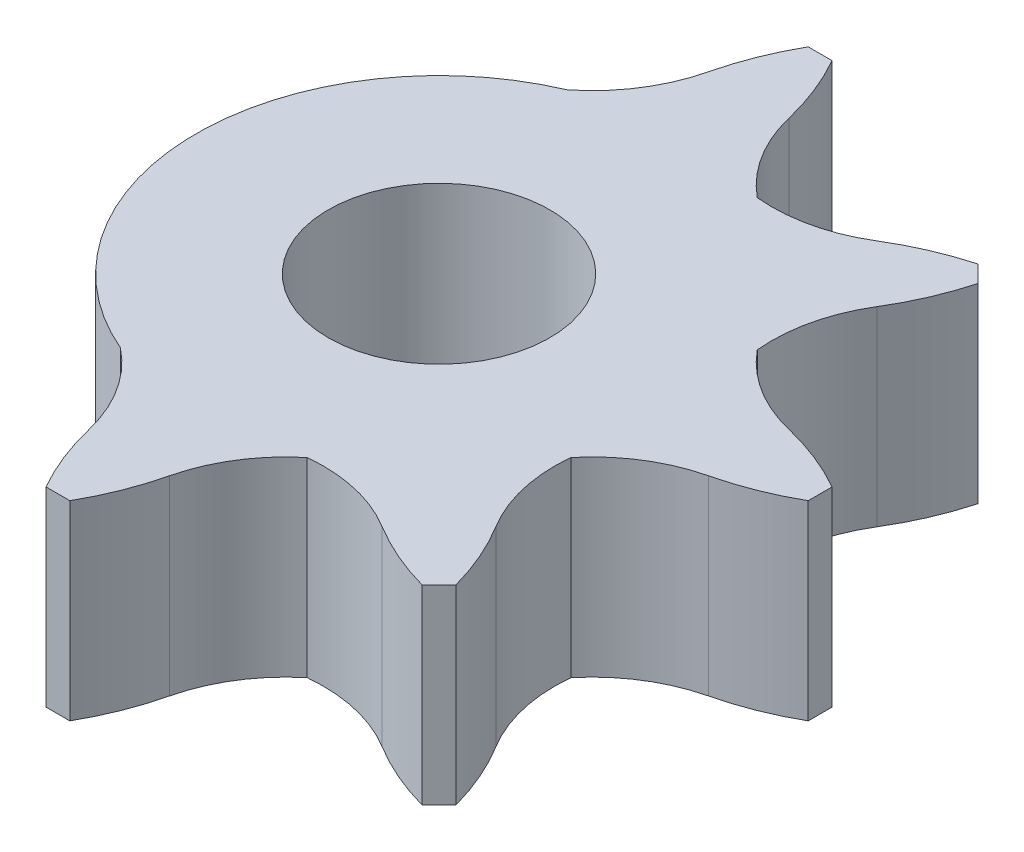
ISO-10303-21;
HEADER;
FILE_DESCRIPTION(('STEP AP214'),'2;1');
FILE_NAME('part.step','',(''),(''),'','','');
FILE_SCHEMA(('AUTOMOTIVE_DESIGN { 1 0 10303 214 1 1 1 1 }'));
ENDSEC;
DATA;
#1=APPLICATION_CONTEXT('core data for automotive mechanical design processes');
#2=APPLICATION_PROTOCOL_DEFINITION('international standard','automotive_design',2000,#1);
#3=PRODUCT_CONTEXT('',#1,'mechanical');
#4=PRODUCT('Part','Part','',(#3));
#5=PRODUCT_RELATED_PRODUCT_CATEGORY('part','',(#4));
#6=PRODUCT_DEFINITION_FORMATION('','',#4);
#7=PRODUCT_DEFINITION_CONTEXT('part definition',#1,'design');
#8=PRODUCT_DEFINITION('design','',#6,#7);
#9=PRODUCT_DEFINITION_SHAPE('','',#8);
#10=(LENGTH_UNIT() NAMED_UNIT(*) SI_UNIT(.MILLI.,.METRE.));
#11=(NAMED_UNIT(*) PLANE_ANGLE_UNIT() SI_UNIT($,.RADIAN.));
#12=(NAMED_UNIT(*) SI_UNIT($,.STERADIAN.) SOLID_ANGLE_UNIT());
#13=UNCERTAINTY_MEASURE_WITH_UNIT(LENGTH_MEASURE(1.E-05),#10,'distance_accuracy_value','');
#14=(GEOMETRIC_REPRESENTATION_CONTEXT(3) GLOBAL_UNCERTAINTY_ASSIGNED_CONTEXT((#13)) GLOBAL_UNIT_ASSIGNED_CONTEXT((#10,
#11,#12)) REPRESENTATION_CONTEXT('',''));
#15=CARTESIAN_POINT('',(0.,0.,0.));
#16=DIRECTION('',(0.,0.,1.));
#17=DIRECTION('',(1.,0.,0.));
#18=AXIS2_PLACEMENT_3D('',#15,#16,#17);
#19=CARTESIAN_POINT('',(4.04111607509691,4.,-7.26168612397691));
#20=DIRECTION('',(0.,-1.,0.));
#21=DIRECTION('',(0.,0.,-1.));
#22=AXIS2_PLACEMENT_3D('',#19,#20,#21);
#23=CYLINDRICAL_SURFACE('',#22,3.28808748273816);
#24=CARTESIAN_POINT('',(4.04111607509691,4.,-7.26168612397691));
#25=DIRECTION('',(0.,1.,0.));
#26=DIRECTION('',(0.,0.,1.));
#27=AXIS2_PLACEMENT_3D('',#24,#25,#26);
#28=CIRCLE('',#27,3.28808748273816);
#29=CARTESIAN_POINT('',(0.843945673684941,4.,-6.49381848012505));
#30=VERTEX_POINT('',#29);
#31=CARTESIAN_POINT('',(1.9550978736436,4.,-4.72002380231716));
#32=VERTEX_POINT('',#31);
#33=EDGE_CURVE('E379',#30,#32,#28,.T.);
#34=ORIENTED_EDGE('',*,*,#33,.T.);
#35=DIRECTION('',(0.,-1.,0.));
#36=VECTOR('',#35,1.);
#37=CARTESIAN_POINT('',(1.9550978736436,2.,-4.72002380231716));
#38=LINE('',#37,#36);
#39=CARTESIAN_POINT('',(1.9550978736436,0.,-4.72002380231716));
#40=VERTEX_POINT('',#39);
#41=EDGE_CURVE('E12',#32,#40,#38,.T.);
#42=ORIENTED_EDGE('',*,*,#41,.T.);
#43=CARTESIAN_POINT('',(4.04111607509691,0.,-7.26168612397691));
#44=DIRECTION('',(0.,1.,0.));
#45=DIRECTION('',(0.,0.,1.));
#46=AXIS2_PLACEMENT_3D('',#43,#44,#45);
#47=CIRCLE('',#46,3.28808748273816);
#48=CARTESIAN_POINT('',(0.843945673684941,0.,-6.49381848012505));
#49=VERTEX_POINT('',#48);
#50=EDGE_CURVE('E380',#49,#40,#47,.T.);
#51=ORIENTED_EDGE('',*,*,#50,.F.);
#52=DIRECTION('',(0.,-1.,0.));
#53=VECTOR('',#52,1.);
#54=CARTESIAN_POINT('',(0.843945673684941,4.,-6.49381848012505));
#55=LINE('',#54,#53);
#56=EDGE_CURVE('E193',#30,#49,#55,.T.);
#57=ORIENTED_EDGE('',*,*,#56,.F.);
#58=EDGE_LOOP('',(#34,#42,#51,#57));
#59=FACE_BOUND('',#58,.T.);
#60=ADVANCED_FACE('F184',(#59),#23,.F.);
#61=CARTESIAN_POINT('',(-4.72492939697395,0.,-5.15633613088156));
#62=DIRECTION('',(0.,-1.,0.));
#63=DIRECTION('',(0.,0.,-1.));
#64=AXIS2_PLACEMENT_3D('',#61,#62,#63);
#65=PLANE('',#64);
#66=CARTESIAN_POINT('',(0.,0.,0.));
#67=DIRECTION('',(0.,1.,0.));
#68=DIRECTION('',(0.,0.,1.));
#69=AXIS2_PLACEMENT_3D('',#66,#67,#68);
#70=CIRCLE('',#69,5.09295817894065);
#71=CARTESIAN_POINT('',(-2.,0.,-4.68382568126083));
#72=VERTEX_POINT('',#71);
#73=CARTESIAN_POINT('',(-2.,0.,4.68382568126083));
#74=VERTEX_POINT('',#73);
#75=EDGE_CURVE('E644',#72,#74,#70,.T.);
#76=ORIENTED_EDGE('',*,*,#75,.F.);
#77=CARTESIAN_POINT('',(-4.04111607509691,0.,-7.26168612397691));
#78=DIRECTION('',(0.,-1.,0.));
#79=DIRECTION('',(0.,0.,-1.));
#80=AXIS2_PLACEMENT_3D('',#77,#78,#79);
#81=CIRCLE('',#80,3.28808748273816);
#82=CARTESIAN_POINT('',(-0.843945673684939,0.,-6.49381848012505));
#83=VERTEX_POINT('',#82);
#84=EDGE_CURVE('E384',#83,#72,#81,.T.);
#85=ORIENTED_EDGE('',*,*,#84,.F.);
#86=CARTESIAN_POINT('',(4.72492939697395,0.,-5.15633613088156));
#87=DIRECTION('',(0.,-1.,0.));
#88=DIRECTION('',(0.,0.,-1.));
#89=AXIS2_PLACEMENT_3D('',#86,#87,#88);
#90=CIRCLE('',#89,5.72723568461644);
#91=CARTESIAN_POINT('',(-0.249999999999999,0.,-7.99381848012505));
#92=VERTEX_POINT('',#91);
#93=EDGE_CURVE('E412',#83,#92,#90,.T.);
#94=ORIENTED_EDGE('',*,*,#93,.T.);
#95=DIRECTION('',(-1.,0.,0.));
#96=VECTOR('',#95,1.);
#97=CARTESIAN_POINT('',(0.25,0.,-7.99381848012505));
#98=LINE('',#97,#96);
#99=CARTESIAN_POINT('',(0.25,0.,-7.99381848012505));
#100=VERTEX_POINT('',#99);
#101=EDGE_CURVE('E390',#100,#92,#98,.T.);
#102=ORIENTED_EDGE('',*,*,#101,.F.);
#103=CARTESIAN_POINT('',(-4.72492939697395,0.,-5.15633613088156));
#104=DIRECTION('',(0.,-1.,0.));
#105=DIRECTION('',(0.,0.,-1.));
#106=AXIS2_PLACEMENT_3D('',#103,#104,#105);
#107=CIRCLE('',#106,5.72723568461644);
#108=EDGE_CURVE('E386',#100,#49,#107,.T.);
#109=ORIENTED_EDGE('',*,*,#108,.T.);
#110=ORIENTED_EDGE('',*,*,#50,.T.);
#111=CARTESIAN_POINT('',(2.27728692084936,0.,-7.99228808137532));
#112=DIRECTION('',(0.,-1.,0.));
#113=DIRECTION('',(0.707106781186549,0.,-0.707106781186546));
#114=AXIS2_PLACEMENT_3D('',#111,#112,#113);
#115=CIRCLE('',#114,3.28808748273816);
#116=CARTESIAN_POINT('',(3.99506337427528,0.,-5.18858279190661));
#117=VERTEX_POINT('',#116);
#118=EDGE_CURVE('E200',#117,#40,#115,.T.);
#119=ORIENTED_EDGE('',*,*,#118,.F.);
#120=CARTESIAN_POINT('',(6.98710986145151,0.,-0.305050626995602));
#121=DIRECTION('',(0.,-1.,0.));
#122=DIRECTION('',(0.707106781186549,0.,-0.707106781186546));
#123=AXIS2_PLACEMENT_3D('',#120,#121,#122);
#124=CIRCLE('',#123,5.72723568461644);
#125=CARTESIAN_POINT('',(5.47570655957414,0.,-5.82925995016739));
#126=VERTEX_POINT('',#125);
#127=EDGE_CURVE('E434',#117,#126,#124,.T.);
#128=ORIENTED_EDGE('',*,*,#127,.T.);
#129=DIRECTION('',(-0.707106781186546,0.,-0.707106781186549));
#130=VECTOR('',#129,1.);
#131=CARTESIAN_POINT('',(5.82925995016741,0.,-5.47570655957412));
#132=LINE('',#131,#130);
#133=CARTESIAN_POINT('',(5.82925995016741,0.,-5.47570655957412));
#134=VERTEX_POINT('',#133);
#135=EDGE_CURVE('E438',#134,#126,#132,.T.);
#136=ORIENTED_EDGE('',*,*,#135,.F.);
#137=CARTESIAN_POINT('',(0.305050626995626,0.,-6.9871098614515));
#138=DIRECTION('',(0.,-1.,0.));
#139=DIRECTION('',(0.707106781186549,0.,-0.707106781186546));
#140=AXIS2_PLACEMENT_3D('',#137,#138,#139);
#141=CIRCLE('',#140,5.72723568461644);
#142=CARTESIAN_POINT('',(5.18858279190662,0.,-3.99506337427526));
#143=VERTEX_POINT('',#142);
#144=EDGE_CURVE('E442',#134,#143,#141,.T.);
#145=ORIENTED_EDGE('',*,*,#144,.T.);
#146=CARTESIAN_POINT('',(7.99228808137533,0.,-2.27728692084933));
#147=DIRECTION('',(0.,1.,0.));
#148=DIRECTION('',(-0.707106781186549,0.,0.707106781186546));
#149=AXIS2_PLACEMENT_3D('',#146,#147,#148);
#150=CIRCLE('',#149,3.28808748273816);
#151=CARTESIAN_POINT('',(4.72002380231717,0.,-1.95509787364358));
#152=VERTEX_POINT('',#151);
#153=EDGE_CURVE('E463',#143,#152,#150,.T.);
#154=ORIENTED_EDGE('',*,*,#153,.T.);
#155=CARTESIAN_POINT('',(7.26168612397693,0.,-4.04111607509688));
#156=DIRECTION('',(0.,-1.,0.));
#157=DIRECTION('',(1.,0.,0.));
#158=AXIS2_PLACEMENT_3D('',#155,#156,#157);
#159=CIRCLE('',#158,3.28808748273816);
#160=CARTESIAN_POINT('',(6.49381848012505,0.,-0.843945673684916));
#161=VERTEX_POINT('',#160);
#162=EDGE_CURVE('E523',#161,#152,#159,.T.);
#163=ORIENTED_EDGE('',*,*,#162,.F.);
#164=CARTESIAN_POINT('',(5.15633613088155,0.,4.72492939697397));
#165=DIRECTION('',(0.,-1.,0.));
#166=DIRECTION('',(1.,0.,0.));
#167=AXIS2_PLACEMENT_3D('',#164,#165,#166);
#168=CIRCLE('',#167,5.72723568461644);
#169=CARTESIAN_POINT('',(7.99381848012505,0.,-0.249999999999971));
#170=VERTEX_POINT('',#169);
#171=EDGE_CURVE('E488',#161,#170,#168,.T.);
#172=ORIENTED_EDGE('',*,*,#171,.T.);
#173=DIRECTION('',(0.,0.,-1.));
#174=VECTOR('',#173,1.);
#175=CARTESIAN_POINT('',(7.99381848012505,0.,0.250000000000028));
#176=LINE('',#175,#174);
#177=CARTESIAN_POINT('',(7.99381848012505,0.,0.250000000000028));
#178=VERTEX_POINT('',#177);
#179=EDGE_CURVE('E492',#178,#170,#176,.T.);
#180=ORIENTED_EDGE('',*,*,#179,.F.);
#181=CARTESIAN_POINT('',(5.15633613088158,0.,-4.72492939697393));
#182=DIRECTION('',(0.,-1.,0.));
#183=DIRECTION('',(1.,0.,0.));
#184=AXIS2_PLACEMENT_3D('',#181,#182,#183);
#185=CIRCLE('',#184,5.72723568461644);
#186=CARTESIAN_POINT('',(6.49381848012505,0.,0.843945673684964));
#187=VERTEX_POINT('',#186);
#188=EDGE_CURVE('E496',#178,#187,#185,.T.);
#189=ORIENTED_EDGE('',*,*,#188,.T.);
#190=CARTESIAN_POINT('',(7.2616861239769,0.,4.04111607509693));
#191=DIRECTION('',(0.,1.,0.));
#192=DIRECTION('',(-1.,0.,0.));
#193=AXIS2_PLACEMENT_3D('',#190,#191,#192);
#194=CIRCLE('',#193,3.28808748273816);
#195=CARTESIAN_POINT('',(4.72002380231715,0.,1.95509787364361));
#196=VERTEX_POINT('',#195);
#197=EDGE_CURVE('E518',#187,#196,#194,.T.);
#198=ORIENTED_EDGE('',*,*,#197,.T.);
#199=CARTESIAN_POINT('',(7.99228808137531,0.,2.27728692084939));
#200=DIRECTION('',(0.,-1.,0.));
#201=DIRECTION('',(0.707106781186544,0.,0.707106781186551));
#202=AXIS2_PLACEMENT_3D('',#199,#200,#201);
#203=CIRCLE('',#202,3.28808748273816);
#204=CARTESIAN_POINT('',(5.18858279190659,0.,3.9950633742753));
#205=VERTEX_POINT('',#204);
#206=EDGE_CURVE('E579',#205,#196,#203,.T.);
#207=ORIENTED_EDGE('',*,*,#206,.F.);
#208=CARTESIAN_POINT('',(0.305050626995577,0.,6.98710986145151));
#209=DIRECTION('',(0.,-1.,0.));
#210=DIRECTION('',(0.707106781186544,0.,0.707106781186551));
#211=AXIS2_PLACEMENT_3D('',#208,#209,#210);
#212=CIRCLE('',#211,5.72723568461644);
#213=CARTESIAN_POINT('',(5.82925995016737,0.,5.47570655957416));
#214=VERTEX_POINT('',#213);
#215=EDGE_CURVE('E544',#205,#214,#212,.T.);
#216=ORIENTED_EDGE('',*,*,#215,.T.);
#217=DIRECTION('',(0.707106781186551,0.,-0.707106781186544));
#218=VECTOR('',#217,1.);
#219=CARTESIAN_POINT('',(5.4757065595741,0.,5.82925995016743));
#220=LINE('',#219,#218);
#221=CARTESIAN_POINT('',(5.4757065595741,0.,5.82925995016743));
#222=VERTEX_POINT('',#221);
#223=EDGE_CURVE('E548',#222,#214,#220,.T.);
#224=ORIENTED_EDGE('',*,*,#223,.F.);
#225=CARTESIAN_POINT('',(6.9871098614515,0.,0.305050626995651));
#226=DIRECTION('',(0.,-1.,0.));
#227=DIRECTION('',(0.707106781186544,0.,0.707106781186551));
#228=AXIS2_PLACEMENT_3D('',#225,#226,#227);
#229=CIRCLE('',#228,5.72723568461644);
#230=CARTESIAN_POINT('',(3.99506337427525,0.,5.18858279190664));
#231=VERTEX_POINT('',#230);
#232=EDGE_CURVE('E552',#222,#231,#229,.T.);
#233=ORIENTED_EDGE('',*,*,#232,.T.);
#234=CARTESIAN_POINT('',(2.2772869208493,0.,7.99228808137533));
#235=DIRECTION('',(0.,1.,0.));
#236=DIRECTION('',(-0.707106781186544,0.,-0.707106781186551));
#237=AXIS2_PLACEMENT_3D('',#234,#235,#236);
#238=CIRCLE('',#237,3.28808748273816);
#239=CARTESIAN_POINT('',(1.95509787364358,0.,4.72002380231717));
#240=VERTEX_POINT('',#239);
#241=EDGE_CURVE('E574',#231,#240,#238,.T.);
#242=ORIENTED_EDGE('',*,*,#241,.T.);
#243=CARTESIAN_POINT('',(4.04111607509691,0.,7.26168612397691));
#244=DIRECTION('',(0.,-1.,0.));
#245=DIRECTION('',(0.,0.,1.));
#246=AXIS2_PLACEMENT_3D('',#243,#244,#245);
#247=CIRCLE('',#246,3.28808748273816);
#248=CARTESIAN_POINT('',(0.843945673684939,0.,6.49381848012505));
#249=VERTEX_POINT('',#248);
#250=EDGE_CURVE('E368',#249,#240,#247,.T.);
#251=ORIENTED_EDGE('',*,*,#250,.F.);
#252=CARTESIAN_POINT('',(-4.72492939697395,0.,5.15633613088156));
#253=DIRECTION('',(0.,-1.,0.));
#254=DIRECTION('',(0.,0.,1.));
#255=AXIS2_PLACEMENT_3D('',#252,#253,#254);
#256=CIRCLE('',#255,5.72723568461644);
#257=CARTESIAN_POINT('',(0.249999999999999,0.,7.99381848012505));
#258=VERTEX_POINT('',#257);
#259=EDGE_CURVE('E600',#249,#258,#256,.T.);
#260=ORIENTED_EDGE('',*,*,#259,.T.);
#261=DIRECTION('',(1.,0.,0.));
#262=VECTOR('',#261,1.);
#263=CARTESIAN_POINT('',(-0.25,0.,7.99381848012505));
#264=LINE('',#263,#262);
#265=CARTESIAN_POINT('',(-0.25,0.,7.99381848012505));
#266=VERTEX_POINT('',#265);
#267=EDGE_CURVE('E604',#266,#258,#264,.T.);
#268=ORIENTED_EDGE('',*,*,#267,.F.);
#269=CARTESIAN_POINT('',(4.72492939697395,0.,5.15633613088156));
#270=DIRECTION('',(0.,-1.,0.));
#271=DIRECTION('',(0.,0.,1.));
#272=AXIS2_PLACEMENT_3D('',#269,#270,#271);
#273=CIRCLE('',#272,5.72723568461644);
#274=CARTESIAN_POINT('',(-0.843945673684941,0.,6.49381848012505));
#275=VERTEX_POINT('',#274);
#276=EDGE_CURVE('E608',#266,#275,#273,.T.);
#277=ORIENTED_EDGE('',*,*,#276,.T.);
#278=CARTESIAN_POINT('',(-4.04111607509691,0.,7.26168612397691));
#279=DIRECTION('',(0.,1.,0.));
#280=DIRECTION('',(0.,0.,-1.));
#281=AXIS2_PLACEMENT_3D('',#278,#279,#280);
#282=CIRCLE('',#281,3.28808748273816);
#283=EDGE_CURVE('E632',#275,#74,#282,.T.);
#284=ORIENTED_EDGE('',*,*,#283,.T.);
#285=EDGE_LOOP('',(#76,#85,#94,#102,#109,#110,#119,#128,#136,#145,#154,#163,#172,#180,#189,#198,
#207,#216,#224,#233,#242,#251,#260,#268,#277,#284));
#286=FACE_BOUND('',#285,.T.);
#287=CARTESIAN_POINT('',(0.,0.,0.));
#288=DIRECTION('',(0.,1.,0.));
#289=DIRECTION('',(0.,0.,1.));
#290=AXIS2_PLACEMENT_3D('',#287,#288,#289);
#291=CIRCLE('',#290,2.325);
#292=CARTESIAN_POINT('',(0.,0.,2.325));
#293=VERTEX_POINT('',#292);
#294=EDGE_CURVE('E647',#293,#293,#291,.T.);
#295=ORIENTED_EDGE('',*,*,#294,.T.);
#296=EDGE_LOOP('',(#295));
#297=FACE_BOUND('',#296,.T.);
#298=ADVANCED_FACE('F659',(#286,#297),#65,.T.);
#299=CARTESIAN_POINT('',(-4.72492939697395,4.,-5.15633613088156));
#300=DIRECTION('',(0.,-1.,0.));
#301=DIRECTION('',(0.,0.,-1.));
#302=AXIS2_PLACEMENT_3D('',#299,#300,#301);
#303=PLANE('',#302);
#304=CARTESIAN_POINT('',(-4.04111607509691,4.,-7.26168612397691));
#305=DIRECTION('',(0.,-1.,0.));
#306=DIRECTION('',(0.,0.,-1.));
#307=AXIS2_PLACEMENT_3D('',#304,#305,#306);
#308=CIRCLE('',#307,3.28808748273816);
#309=CARTESIAN_POINT('',(-0.843945673684939,4.,-6.49381848012505));
#310=VERTEX_POINT('',#309);
#311=CARTESIAN_POINT('',(-2.,4.,-4.68382568126083));
#312=VERTEX_POINT('',#311);
#313=EDGE_CURVE('E372',#310,#312,#308,.T.);
#314=ORIENTED_EDGE('',*,*,#313,.T.);
#315=CARTESIAN_POINT('',(0.,4.,0.));
#316=DIRECTION('',(0.,1.,0.));
#317=DIRECTION('',(0.,0.,1.));
#318=AXIS2_PLACEMENT_3D('',#315,#316,#317);
#319=CIRCLE('',#318,5.09295817894065);
#320=CARTESIAN_POINT('',(-2.,4.,4.68382568126083));
#321=VERTEX_POINT('',#320);
#322=EDGE_CURVE('E356',#312,#321,#319,.T.);
#323=ORIENTED_EDGE('',*,*,#322,.T.);
#324=CARTESIAN_POINT('',(-4.04111607509691,4.,7.26168612397691));
#325=DIRECTION('',(0.,1.,0.));
#326=DIRECTION('',(0.,0.,-1.));
#327=AXIS2_PLACEMENT_3D('',#324,#325,#326);
#328=CIRCLE('',#327,3.28808748273816);
#329=CARTESIAN_POINT('',(-0.843945673684941,4.,6.49381848012505));
#330=VERTEX_POINT('',#329);
#331=EDGE_CURVE('E631',#330,#321,#328,.T.);
#332=ORIENTED_EDGE('',*,*,#331,.F.);
#333=CARTESIAN_POINT('',(4.72492939697395,4.,5.15633613088156));
#334=DIRECTION('',(0.,-1.,0.));
#335=DIRECTION('',(0.,0.,1.));
#336=AXIS2_PLACEMENT_3D('',#333,#334,#335);
#337=CIRCLE('',#336,5.72723568461644);
#338=CARTESIAN_POINT('',(-0.25,4.,7.99381848012505));
#339=VERTEX_POINT('',#338);
#340=EDGE_CURVE('E603',#339,#330,#337,.T.);
#341=ORIENTED_EDGE('',*,*,#340,.F.);
#342=DIRECTION('',(1.,0.,0.));
#343=VECTOR('',#342,1.);
#344=CARTESIAN_POINT('',(-0.25,4.,7.99381848012505));
#345=LINE('',#344,#343);
#346=CARTESIAN_POINT('',(0.249999999999999,4.,7.99381848012505));
#347=VERTEX_POINT('',#346);
#348=EDGE_CURVE('E614',#339,#347,#345,.T.);
#349=ORIENTED_EDGE('',*,*,#348,.T.);
#350=CARTESIAN_POINT('',(-4.72492939697395,4.,5.15633613088156));
#351=DIRECTION('',(0.,-1.,0.));
#352=DIRECTION('',(0.,0.,1.));
#353=AXIS2_PLACEMENT_3D('',#350,#351,#352);
#354=CIRCLE('',#353,5.72723568461644);
#355=CARTESIAN_POINT('',(0.843945673684941,4.,6.49381848012505));
#356=VERTEX_POINT('',#355);
#357=EDGE_CURVE('E599',#356,#347,#354,.T.);
#358=ORIENTED_EDGE('',*,*,#357,.F.);
#359=CARTESIAN_POINT('',(4.04111607509691,4.,7.26168612397691));
#360=DIRECTION('',(0.,-1.,0.));
#361=DIRECTION('',(0.,0.,1.));
#362=AXIS2_PLACEMENT_3D('',#359,#360,#361);
#363=CIRCLE('',#362,3.28808748273816);
#364=CARTESIAN_POINT('',(1.95509787364358,4.,4.72002380231717));
#365=VERTEX_POINT('',#364);
#366=EDGE_CURVE('E636',#356,#365,#363,.T.);
#367=ORIENTED_EDGE('',*,*,#366,.T.);
#368=CARTESIAN_POINT('',(2.2772869208493,4.,7.99228808137533));
#369=DIRECTION('',(0.,1.,0.));
#370=DIRECTION('',(-0.707106781186544,0.,-0.707106781186551));
#371=AXIS2_PLACEMENT_3D('',#368,#369,#370);
#372=CIRCLE('',#371,3.28808748273816);
#373=CARTESIAN_POINT('',(3.99506337427525,4.,5.18858279190664));
#374=VERTEX_POINT('',#373);
#375=EDGE_CURVE('E573',#374,#365,#372,.T.);
#376=ORIENTED_EDGE('',*,*,#375,.F.);
#377=CARTESIAN_POINT('',(6.9871098614515,4.,0.305050626995651));
#378=DIRECTION('',(0.,-1.,0.));
#379=DIRECTION('',(0.707106781186544,0.,0.707106781186551));
#380=AXIS2_PLACEMENT_3D('',#377,#378,#379);
#381=CIRCLE('',#380,5.72723568461644);
#382=CARTESIAN_POINT('',(5.4757065595741,4.,5.82925995016743));
#383=VERTEX_POINT('',#382);
#384=EDGE_CURVE('E547',#383,#374,#381,.T.);
#385=ORIENTED_EDGE('',*,*,#384,.F.);
#386=DIRECTION('',(0.707106781186551,0.,-0.707106781186544));
#387=VECTOR('',#386,1.);
#388=CARTESIAN_POINT('',(5.4757065595741,4.,5.82925995016743));
#389=LINE('',#388,#387);
#390=CARTESIAN_POINT('',(5.82925995016737,4.,5.47570655957416));
#391=VERTEX_POINT('',#390);
#392=EDGE_CURVE('E559',#383,#391,#389,.T.);
#393=ORIENTED_EDGE('',*,*,#392,.T.);
#394=CARTESIAN_POINT('',(0.305050626995577,4.,6.98710986145151));
#395=DIRECTION('',(0.,-1.,0.));
#396=DIRECTION('',(0.707106781186544,0.,0.707106781186551));
#397=AXIS2_PLACEMENT_3D('',#394,#395,#396);
#398=CIRCLE('',#397,5.72723568461644);
#399=CARTESIAN_POINT('',(5.18858279190659,4.,3.9950633742753));
#400=VERTEX_POINT('',#399);
#401=EDGE_CURVE('E543',#400,#391,#398,.T.);
#402=ORIENTED_EDGE('',*,*,#401,.F.);
#403=CARTESIAN_POINT('',(7.99228808137531,4.,2.27728692084939));
#404=DIRECTION('',(0.,-1.,0.));
#405=DIRECTION('',(0.707106781186544,0.,0.707106781186551));
#406=AXIS2_PLACEMENT_3D('',#403,#404,#405);
#407=CIRCLE('',#406,3.28808748273816);
#408=CARTESIAN_POINT('',(4.72002380231715,4.,1.95509787364361));
#409=VERTEX_POINT('',#408);
#410=EDGE_CURVE('E578',#400,#409,#407,.T.);
#411=ORIENTED_EDGE('',*,*,#410,.T.);
#412=CARTESIAN_POINT('',(7.2616861239769,4.,4.04111607509693));
#413=DIRECTION('',(0.,1.,0.));
#414=DIRECTION('',(-1.,0.,0.));
#415=AXIS2_PLACEMENT_3D('',#412,#413,#414);
#416=CIRCLE('',#415,3.28808748273816);
#417=CARTESIAN_POINT('',(6.49381848012505,4.,0.843945673684964));
#418=VERTEX_POINT('',#417);
#419=EDGE_CURVE('E517',#418,#409,#416,.T.);
#420=ORIENTED_EDGE('',*,*,#419,.F.);
#421=CARTESIAN_POINT('',(5.15633613088158,4.,-4.72492939697393));
#422=DIRECTION('',(0.,-1.,0.));
#423=DIRECTION('',(1.,0.,0.));
#424=AXIS2_PLACEMENT_3D('',#421,#422,#423);
#425=CIRCLE('',#424,5.72723568461644);
#426=CARTESIAN_POINT('',(7.99381848012505,4.,0.250000000000028));
#427=VERTEX_POINT('',#426);
#428=EDGE_CURVE('E491',#427,#418,#425,.T.);
#429=ORIENTED_EDGE('',*,*,#428,.F.);
#430=DIRECTION('',(0.,0.,-1.));
#431=VECTOR('',#430,1.);
#432=CARTESIAN_POINT('',(7.99381848012505,4.,0.250000000000028));
#433=LINE('',#432,#431);
#434=CARTESIAN_POINT('',(7.99381848012505,4.,-0.249999999999971));
#435=VERTEX_POINT('',#434);
#436=EDGE_CURVE('E503',#427,#435,#433,.T.);
#437=ORIENTED_EDGE('',*,*,#436,.T.);
#438=CARTESIAN_POINT('',(5.15633613088155,4.,4.72492939697397));
#439=DIRECTION('',(0.,-1.,0.));
#440=DIRECTION('',(1.,0.,0.));
#441=AXIS2_PLACEMENT_3D('',#438,#439,#440);
#442=CIRCLE('',#441,5.72723568461644);
#443=CARTESIAN_POINT('',(6.49381848012505,4.,-0.843945673684918));
#444=VERTEX_POINT('',#443);
#445=EDGE_CURVE('E487',#444,#435,#442,.T.);
#446=ORIENTED_EDGE('',*,*,#445,.F.);
#447=CARTESIAN_POINT('',(7.26168612397693,4.,-4.04111607509688));
#448=DIRECTION('',(0.,-1.,0.));
#449=DIRECTION('',(1.,0.,0.));
#450=AXIS2_PLACEMENT_3D('',#447,#448,#449);
#451=CIRCLE('',#450,3.28808748273816);
#452=CARTESIAN_POINT('',(4.72002380231717,4.,-1.95509787364358));
#453=VERTEX_POINT('',#452);
#454=EDGE_CURVE('E522',#444,#453,#451,.T.);
#455=ORIENTED_EDGE('',*,*,#454,.T.);
#456=CARTESIAN_POINT('',(7.99228808137533,4.,-2.27728692084933));
#457=DIRECTION('',(0.,1.,0.));
#458=DIRECTION('',(-0.707106781186549,0.,0.707106781186546));
#459=AXIS2_PLACEMENT_3D('',#456,#457,#458);
#460=CIRCLE('',#459,3.28808748273816);
#461=CARTESIAN_POINT('',(5.18858279190662,4.,-3.99506337427526));
#462=VERTEX_POINT('',#461);
#463=EDGE_CURVE('E462',#462,#453,#460,.T.);
#464=ORIENTED_EDGE('',*,*,#463,.F.);
#465=CARTESIAN_POINT('',(0.305050626995626,4.,-6.9871098614515));
#466=DIRECTION('',(0.,-1.,0.));
#467=DIRECTION('',(0.707106781186549,0.,-0.707106781186546));
#468=AXIS2_PLACEMENT_3D('',#465,#466,#467);
#469=CIRCLE('',#468,5.72723568461644);
#470=CARTESIAN_POINT('',(5.82925995016741,4.,-5.47570655957412));
#471=VERTEX_POINT('',#470);
#472=EDGE_CURVE('E437',#471,#462,#469,.T.);
#473=ORIENTED_EDGE('',*,*,#472,.F.);
#474=DIRECTION('',(-0.707106781186546,0.,-0.707106781186549));
#475=VECTOR('',#474,1.);
#476=CARTESIAN_POINT('',(5.82925995016741,4.,-5.47570655957412));
#477=LINE('',#476,#475);
#478=CARTESIAN_POINT('',(5.47570655957414,4.,-5.82925995016739));
#479=VERTEX_POINT('',#478);
#480=EDGE_CURVE('E449',#471,#479,#477,.T.);
#481=ORIENTED_EDGE('',*,*,#480,.T.);
#482=CARTESIAN_POINT('',(6.98710986145151,4.,-0.305050626995602));
#483=DIRECTION('',(0.,-1.,0.));
#484=DIRECTION('',(0.707106781186549,0.,-0.707106781186546));
#485=AXIS2_PLACEMENT_3D('',#482,#483,#484);
#486=CIRCLE('',#485,5.72723568461644);
#487=CARTESIAN_POINT('',(3.99506337427528,4.,-5.18858279190661));
#488=VERTEX_POINT('',#487);
#489=EDGE_CURVE('E433',#488,#479,#486,.T.);
#490=ORIENTED_EDGE('',*,*,#489,.F.);
#491=CARTESIAN_POINT('',(2.27728692084936,4.,-7.99228808137532));
#492=DIRECTION('',(0.,-1.,0.));
#493=DIRECTION('',(0.707106781186549,0.,-0.707106781186546));
#494=AXIS2_PLACEMENT_3D('',#491,#492,#493);
#495=CIRCLE('',#494,3.28808748273816);
#496=EDGE_CURVE('E467',#488,#32,#495,.T.);
#497=ORIENTED_EDGE('',*,*,#496,.T.);
#498=ORIENTED_EDGE('',*,*,#33,.F.);
#499=CARTESIAN_POINT('',(-4.72492939697395,4.,-5.15633613088156));
#500=DIRECTION('',(0.,-1.,0.));
#501=DIRECTION('',(0.,0.,-1.));
#502=AXIS2_PLACEMENT_3D('',#499,#500,#501);
#503=CIRCLE('',#502,5.72723568461644);
#504=CARTESIAN_POINT('',(0.25,4.,-7.99381848012505));
#505=VERTEX_POINT('',#504);
#506=EDGE_CURVE('E415',#505,#30,#503,.T.);
#507=ORIENTED_EDGE('',*,*,#506,.F.);
#508=DIRECTION('',(-1.,0.,0.));
#509=VECTOR('',#508,1.);
#510=CARTESIAN_POINT('',(0.25,4.,-7.99381848012505));
#511=LINE('',#510,#509);
#512=CARTESIAN_POINT('',(-0.249999999999999,4.,-7.99381848012505));
#513=VERTEX_POINT('',#512);
#514=EDGE_CURVE('E421',#505,#513,#511,.T.);
#515=ORIENTED_EDGE('',*,*,#514,.T.);
#516=CARTESIAN_POINT('',(4.72492939697395,4.,-5.15633613088156));
#517=DIRECTION('',(0.,-1.,0.));
#518=DIRECTION('',(0.,0.,-1.));
#519=AXIS2_PLACEMENT_3D('',#516,#517,#518);
#520=CIRCLE('',#519,5.72723568461644);
#521=EDGE_CURVE('E376',#310,#513,#520,.T.);
#522=ORIENTED_EDGE('',*,*,#521,.F.);
#523=EDGE_LOOP('',(#314,#323,#332,#341,#349,#358,#367,#376,#385,#393,#402,#411,#420,#429,#437,
#446,#455,#464,#473,#481,#490,#497,#498,#507,#515,#522));
#524=FACE_BOUND('',#523,.T.);
#525=CARTESIAN_POINT('',(0.,4.,0.));
#526=DIRECTION('',(0.,1.,0.));
#527=DIRECTION('',(0.,0.,1.));
#528=AXIS2_PLACEMENT_3D('',#525,#526,#527);
#529=CIRCLE('',#528,2.325);
#530=CARTESIAN_POINT('',(0.,4.,2.325));
#531=VERTEX_POINT('',#530);
#532=EDGE_CURVE('E369',#531,#531,#529,.T.);
#533=ORIENTED_EDGE('',*,*,#532,.F.);
#534=EDGE_LOOP('',(#533));
#535=FACE_BOUND('',#534,.T.);
#536=ADVANCED_FACE('F373',(#524,#535),#303,.F.);
#537=CARTESIAN_POINT('',(0.25,4.,-7.99381848012505));
#538=DIRECTION('',(0.,0.,1.));
#539=DIRECTION('',(1.,0.,0.));
#540=AXIS2_PLACEMENT_3D('',#537,#538,#539);
#541=PLANE('',#540);
#542=ORIENTED_EDGE('',*,*,#101,.T.);
#543=DIRECTION('',(0.,-1.,0.));
#544=VECTOR('',#543,1.);
#545=CARTESIAN_POINT('',(-0.249999999999999,4.,-7.99381848012505));
#546=LINE('',#545,#544);
#547=EDGE_CURVE('E408',#513,#92,#546,.T.);
#548=ORIENTED_EDGE('',*,*,#547,.F.);
#549=ORIENTED_EDGE('',*,*,#514,.F.);
#550=DIRECTION('',(0.,-1.,0.));
#551=VECTOR('',#550,1.);
#552=CARTESIAN_POINT('',(0.25,4.,-7.99381848012505));
#553=LINE('',#552,#551);
#554=EDGE_CURVE('E405',#505,#100,#553,.T.);
#555=ORIENTED_EDGE('',*,*,#554,.T.);
#556=EDGE_LOOP('',(#542,#548,#549,#555));
#557=FACE_BOUND('',#556,.T.);
#558=ADVANCED_FACE('F658',(#557),#541,.F.);
#559=CARTESIAN_POINT('',(4.72492939697395,4.,-5.15633613088156));
#560=DIRECTION('',(0.,-1.,0.));
#561=DIRECTION('',(0.,0.,-1.));
#562=AXIS2_PLACEMENT_3D('',#559,#560,#561);
#563=CYLINDRICAL_SURFACE('',#562,5.72723568461644);
#564=ORIENTED_EDGE('',*,*,#93,.F.);
#565=DIRECTION('',(0.,-1.,0.));
#566=VECTOR('',#565,1.);
#567=CARTESIAN_POINT('',(-0.843945673684939,4.,-6.49381848012505));
#568=LINE('',#567,#566);
#569=EDGE_CURVE('E207',#83,#310,#568,.F.);
#570=ORIENTED_EDGE('',*,*,#569,.T.);
#571=ORIENTED_EDGE('',*,*,#521,.T.);
#572=ORIENTED_EDGE('',*,*,#547,.T.);
#573=EDGE_LOOP('',(#564,#570,#571,#572));
#574=FACE_BOUND('',#573,.T.);
#575=ADVANCED_FACE('F666',(#574),#563,.T.);
#576=CARTESIAN_POINT('',(-4.72492939697395,4.,-5.15633613088156));
#577=DIRECTION('',(0.,-1.,0.));
#578=DIRECTION('',(0.,0.,-1.));
#579=AXIS2_PLACEMENT_3D('',#576,#577,#578);
#580=CYLINDRICAL_SURFACE('',#579,5.72723568461644);
#581=ORIENTED_EDGE('',*,*,#506,.T.);
#582=ORIENTED_EDGE('',*,*,#56,.T.);
#583=ORIENTED_EDGE('',*,*,#108,.F.);
#584=ORIENTED_EDGE('',*,*,#554,.F.);
#585=EDGE_LOOP('',(#581,#582,#583,#584));
#586=FACE_BOUND('',#585,.T.);
#587=ADVANCED_FACE('F671',(#586),#580,.T.);
#588=CARTESIAN_POINT('',(-4.04111607509691,4.,-7.26168612397691));
#589=DIRECTION('',(0.,-1.,0.));
#590=DIRECTION('',(0.,0.,-1.));
#591=AXIS2_PLACEMENT_3D('',#588,#589,#590);
#592=CYLINDRICAL_SURFACE('',#591,3.28808748273816);
#593=ORIENTED_EDGE('',*,*,#84,.T.);
#594=DIRECTION('',(0.,-1.,0.));
#595=VECTOR('',#594,1.);
#596=CARTESIAN_POINT('',(-2.,4.,-4.68382568126083));
#597=LINE('',#596,#595);
#598=EDGE_CURVE('E360',#312,#72,#597,.T.);
#599=ORIENTED_EDGE('',*,*,#598,.F.);
#600=ORIENTED_EDGE('',*,*,#313,.F.);
#601=ORIENTED_EDGE('',*,*,#569,.F.);
#602=EDGE_LOOP('',(#593,#599,#600,#601));
#603=FACE_BOUND('',#602,.T.);
#604=ADVANCED_FACE('F186',(#603),#592,.F.);
#605=CARTESIAN_POINT('',(0.305050626995626,4.,-6.9871098614515));
#606=DIRECTION('',(0.,-1.,0.));
#607=DIRECTION('',(0.,0.,-1.));
#608=AXIS2_PLACEMENT_3D('',#605,#606,#607);
#609=CYLINDRICAL_SURFACE('',#608,5.72723568461644);
#610=ORIENTED_EDGE('',*,*,#472,.T.);
#611=DIRECTION('',(0.,-1.,0.));
#612=VECTOR('',#611,1.);
#613=CARTESIAN_POINT('',(5.18858279190662,4.,-3.99506337427526));
#614=LINE('',#613,#612);
#615=EDGE_CURVE('E446',#462,#143,#614,.T.);
#616=ORIENTED_EDGE('',*,*,#615,.T.);
#617=ORIENTED_EDGE('',*,*,#144,.F.);
#618=DIRECTION('',(0.,-1.,0.));
#619=VECTOR('',#618,1.);
#620=CARTESIAN_POINT('',(5.82925995016741,4.,-5.47570655957412));
#621=LINE('',#620,#619);
#622=EDGE_CURVE('E399',#471,#134,#621,.T.);
#623=ORIENTED_EDGE('',*,*,#622,.F.);
#624=EDGE_LOOP('',(#610,#616,#617,#623));
#625=FACE_BOUND('',#624,.T.);
#626=ADVANCED_FACE('F673',(#625),#609,.T.);
#627=CARTESIAN_POINT('',(6.98710986145151,4.,-0.305050626995602));
#628=DIRECTION('',(0.,-1.,0.));
#629=DIRECTION('',(0.,0.,-1.));
#630=AXIS2_PLACEMENT_3D('',#627,#628,#629);
#631=CYLINDRICAL_SURFACE('',#630,5.72723568461644);
#632=ORIENTED_EDGE('',*,*,#127,.F.);
#633=DIRECTION('',(0.,-1.,0.));
#634=VECTOR('',#633,1.);
#635=CARTESIAN_POINT('',(3.99506337427528,4.,-5.18858279190661));
#636=LINE('',#635,#634);
#637=EDGE_CURVE('E459',#488,#117,#636,.T.);
#638=ORIENTED_EDGE('',*,*,#637,.F.);
#639=ORIENTED_EDGE('',*,*,#489,.T.);
#640=DIRECTION('',(0.,-1.,0.));
#641=VECTOR('',#640,1.);
#642=CARTESIAN_POINT('',(5.47570655957414,4.,-5.82925995016739));
#643=LINE('',#642,#641);
#644=EDGE_CURVE('E429',#479,#126,#643,.T.);
#645=ORIENTED_EDGE('',*,*,#644,.T.);
#646=EDGE_LOOP('',(#632,#638,#639,#645));
#647=FACE_BOUND('',#646,.T.);
#648=ADVANCED_FACE('F760',(#647),#631,.T.);
#649=CARTESIAN_POINT('',(5.82925995016741,4.,-5.47570655957412));
#650=DIRECTION('',(-0.707106781186549,0.,0.707106781186546));
#651=DIRECTION('',(0.707106781186546,0.,0.707106781186549));
#652=AXIS2_PLACEMENT_3D('',#649,#650,#651);
#653=PLANE('',#652);
#654=ORIENTED_EDGE('',*,*,#135,.T.);
#655=ORIENTED_EDGE('',*,*,#644,.F.);
#656=ORIENTED_EDGE('',*,*,#480,.F.);
#657=ORIENTED_EDGE('',*,*,#622,.T.);
#658=EDGE_LOOP('',(#654,#655,#656,#657));
#659=FACE_BOUND('',#658,.T.);
#660=ADVANCED_FACE('F757',(#659),#653,.F.);
#661=CARTESIAN_POINT('',(7.99228808137533,4.,-2.27728692084933));
#662=DIRECTION('',(0.,-1.,0.));
#663=DIRECTION('',(0.,0.,-1.));
#664=AXIS2_PLACEMENT_3D('',#661,#662,#663);
#665=CYLINDRICAL_SURFACE('',#664,3.28808748273816);
#666=ORIENTED_EDGE('',*,*,#463,.T.);
#667=DIRECTION('',(0.,-1.,0.));
#668=VECTOR('',#667,1.);
#669=CARTESIAN_POINT('',(4.72002380231717,2.,-1.95509787364358));
#670=LINE('',#669,#668);
#671=EDGE_CURVE('E470',#453,#152,#670,.T.);
#672=ORIENTED_EDGE('',*,*,#671,.T.);
#673=ORIENTED_EDGE('',*,*,#153,.F.);
#674=ORIENTED_EDGE('',*,*,#615,.F.);
#675=EDGE_LOOP('',(#666,#672,#673,#674));
#676=FACE_BOUND('',#675,.T.);
#677=ADVANCED_FACE('F748',(#676),#665,.F.);
#678=CARTESIAN_POINT('',(2.27728692084936,4.,-7.99228808137532));
#679=DIRECTION('',(0.,-1.,0.));
#680=DIRECTION('',(0.,0.,-1.));
#681=AXIS2_PLACEMENT_3D('',#678,#679,#680);
#682=CYLINDRICAL_SURFACE('',#681,3.28808748273816);
#683=ORIENTED_EDGE('',*,*,#41,.F.);
#684=ORIENTED_EDGE('',*,*,#496,.F.);
#685=ORIENTED_EDGE('',*,*,#637,.T.);
#686=ORIENTED_EDGE('',*,*,#118,.T.);
#687=EDGE_LOOP('',(#683,#684,#685,#686));
#688=FACE_BOUND('',#687,.T.);
#689=ADVANCED_FACE('F762',(#688),#682,.F.);
#690=CARTESIAN_POINT('',(5.15633613088158,4.,-4.72492939697393));
#691=DIRECTION('',(0.,-1.,0.));
#692=DIRECTION('',(0.,0.,-1.));
#693=AXIS2_PLACEMENT_3D('',#690,#691,#692);
#694=CYLINDRICAL_SURFACE('',#693,5.72723568461644);
#695=ORIENTED_EDGE('',*,*,#428,.T.);
#696=DIRECTION('',(0.,-1.,0.));
#697=VECTOR('',#696,1.);
#698=CARTESIAN_POINT('',(6.49381848012505,4.,0.843945673684964));
#699=LINE('',#698,#697);
#700=EDGE_CURVE('E500',#418,#187,#699,.T.);
#701=ORIENTED_EDGE('',*,*,#700,.T.);
#702=ORIENTED_EDGE('',*,*,#188,.F.);
#703=DIRECTION('',(0.,-1.,0.));
#704=VECTOR('',#703,1.);
#705=CARTESIAN_POINT('',(7.99381848012505,4.,0.250000000000028));
#706=LINE('',#705,#704);
#707=EDGE_CURVE('E480',#427,#178,#706,.T.);
#708=ORIENTED_EDGE('',*,*,#707,.F.);
#709=EDGE_LOOP('',(#695,#701,#702,#708));
#710=FACE_BOUND('',#709,.T.);
#711=ADVANCED_FACE('F733',(#710),#694,.T.);
#712=CARTESIAN_POINT('',(5.15633613088155,4.,4.72492939697397));
#713=DIRECTION('',(0.,-1.,0.));
#714=DIRECTION('',(0.,0.,-1.));
#715=AXIS2_PLACEMENT_3D('',#712,#713,#714);
#716=CYLINDRICAL_SURFACE('',#715,5.72723568461644);
#717=ORIENTED_EDGE('',*,*,#171,.F.);
#718=DIRECTION('',(0.,-1.,0.));
#719=VECTOR('',#718,1.);
#720=CARTESIAN_POINT('',(6.49381848012505,4.,-0.843945673684918));
#721=LINE('',#720,#719);
#722=EDGE_CURVE('E513',#444,#161,#721,.T.);
#723=ORIENTED_EDGE('',*,*,#722,.F.);
#724=ORIENTED_EDGE('',*,*,#445,.T.);
#725=DIRECTION('',(0.,-1.,0.));
#726=VECTOR('',#725,1.);
#727=CARTESIAN_POINT('',(7.99381848012505,4.,-0.249999999999971));
#728=LINE('',#727,#726);
#729=EDGE_CURVE('E483',#435,#170,#728,.T.);
#730=ORIENTED_EDGE('',*,*,#729,.T.);
#731=EDGE_LOOP('',(#717,#723,#724,#730));
#732=FACE_BOUND('',#731,.T.);
#733=ADVANCED_FACE('F744',(#732),#716,.T.);
#734=CARTESIAN_POINT('',(7.99381848012505,4.,0.250000000000028));
#735=DIRECTION('',(-1.,0.,0.));
#736=DIRECTION('',(0.,0.,1.));
#737=AXIS2_PLACEMENT_3D('',#734,#735,#736);
#738=PLANE('',#737);
#739=ORIENTED_EDGE('',*,*,#179,.T.);
#740=ORIENTED_EDGE('',*,*,#729,.F.);
#741=ORIENTED_EDGE('',*,*,#436,.F.);
#742=ORIENTED_EDGE('',*,*,#707,.T.);
#743=EDGE_LOOP('',(#739,#740,#741,#742));
#744=FACE_BOUND('',#743,.T.);
#745=ADVANCED_FACE('F738',(#744),#738,.F.);
#746=CARTESIAN_POINT('',(7.2616861239769,4.,4.04111607509693));
#747=DIRECTION('',(0.,-1.,0.));
#748=DIRECTION('',(0.,0.,-1.));
#749=AXIS2_PLACEMENT_3D('',#746,#747,#748);
#750=CYLINDRICAL_SURFACE('',#749,3.28808748273816);
#751=ORIENTED_EDGE('',*,*,#419,.T.);
#752=DIRECTION('',(0.,-1.,0.));
#753=VECTOR('',#752,1.);
#754=CARTESIAN_POINT('',(4.72002380231715,2.,1.95509787364361));
#755=LINE('',#754,#753);
#756=EDGE_CURVE('E526',#409,#196,#755,.T.);
#757=ORIENTED_EDGE('',*,*,#756,.T.);
#758=ORIENTED_EDGE('',*,*,#197,.F.);
#759=ORIENTED_EDGE('',*,*,#700,.F.);
#760=EDGE_LOOP('',(#751,#757,#758,#759));
#761=FACE_BOUND('',#760,.T.);
#762=ADVANCED_FACE('F730',(#761),#750,.F.);
#763=CARTESIAN_POINT('',(7.26168612397693,4.,-4.04111607509688));
#764=DIRECTION('',(0.,-1.,0.));
#765=DIRECTION('',(0.,0.,-1.));
#766=AXIS2_PLACEMENT_3D('',#763,#764,#765);
#767=CYLINDRICAL_SURFACE('',#766,3.28808748273816);
#768=ORIENTED_EDGE('',*,*,#671,.F.);
#769=ORIENTED_EDGE('',*,*,#454,.F.);
#770=ORIENTED_EDGE('',*,*,#722,.T.);
#771=ORIENTED_EDGE('',*,*,#162,.T.);
#772=EDGE_LOOP('',(#768,#769,#770,#771));
#773=FACE_BOUND('',#772,.T.);
#774=ADVANCED_FACE('F746',(#773),#767,.F.);
#775=CARTESIAN_POINT('',(6.9871098614515,4.,0.305050626995651));
#776=DIRECTION('',(0.,-1.,0.));
#777=DIRECTION('',(0.,0.,-1.));
#778=AXIS2_PLACEMENT_3D('',#775,#776,#777);
#779=CYLINDRICAL_SURFACE('',#778,5.72723568461644);
#780=ORIENTED_EDGE('',*,*,#384,.T.);
#781=DIRECTION('',(0.,-1.,0.));
#782=VECTOR('',#781,1.);
#783=CARTESIAN_POINT('',(3.99506337427525,4.,5.18858279190664));
#784=LINE('',#783,#782);
#785=EDGE_CURVE('E556',#374,#231,#784,.T.);
#786=ORIENTED_EDGE('',*,*,#785,.T.);
#787=ORIENTED_EDGE('',*,*,#232,.F.);
#788=DIRECTION('',(0.,-1.,0.));
#789=VECTOR('',#788,1.);
#790=CARTESIAN_POINT('',(5.4757065595741,4.,5.82925995016743));
#791=LINE('',#790,#789);
#792=EDGE_CURVE('E536',#383,#222,#791,.T.);
#793=ORIENTED_EDGE('',*,*,#792,.F.);
#794=EDGE_LOOP('',(#780,#786,#787,#793));
#795=FACE_BOUND('',#794,.T.);
#796=ADVANCED_FACE('F714',(#795),#779,.T.);
#797=CARTESIAN_POINT('',(0.305050626995577,4.,6.98710986145151));
#798=DIRECTION('',(0.,-1.,0.));
#799=DIRECTION('',(0.,0.,-1.));
#800=AXIS2_PLACEMENT_3D('',#797,#798,#799);
#801=CYLINDRICAL_SURFACE('',#800,5.72723568461644);
#802=ORIENTED_EDGE('',*,*,#215,.F.);
#803=DIRECTION('',(0.,-1.,0.));
#804=VECTOR('',#803,1.);
#805=CARTESIAN_POINT('',(5.18858279190659,4.,3.9950633742753));
#806=LINE('',#805,#804);
#807=EDGE_CURVE('E569',#400,#205,#806,.T.);
#808=ORIENTED_EDGE('',*,*,#807,.F.);
#809=ORIENTED_EDGE('',*,*,#401,.T.);
#810=DIRECTION('',(0.,-1.,0.));
#811=VECTOR('',#810,1.);
#812=CARTESIAN_POINT('',(5.82925995016737,4.,5.47570655957416));
#813=LINE('',#812,#811);
#814=EDGE_CURVE('E539',#391,#214,#813,.T.);
#815=ORIENTED_EDGE('',*,*,#814,.T.);
#816=EDGE_LOOP('',(#802,#808,#809,#815));
#817=FACE_BOUND('',#816,.T.);
#818=ADVANCED_FACE('F723',(#817),#801,.T.);
#819=CARTESIAN_POINT('',(5.4757065595741,4.,5.82925995016743));
#820=DIRECTION('',(-0.707106781186544,0.,-0.707106781186551));
#821=DIRECTION('',(-0.707106781186551,0.,0.707106781186544));
#822=AXIS2_PLACEMENT_3D('',#819,#820,#821);
#823=PLANE('',#822);
#824=ORIENTED_EDGE('',*,*,#223,.T.);
#825=ORIENTED_EDGE('',*,*,#814,.F.);
#826=ORIENTED_EDGE('',*,*,#392,.F.);
#827=ORIENTED_EDGE('',*,*,#792,.T.);
#828=EDGE_LOOP('',(#824,#825,#826,#827));
#829=FACE_BOUND('',#828,.T.);
#830=ADVANCED_FACE('F720',(#829),#823,.F.);
#831=CARTESIAN_POINT('',(2.2772869208493,4.,7.99228808137533));
#832=DIRECTION('',(0.,-1.,0.));
#833=DIRECTION('',(0.,0.,-1.));
#834=AXIS2_PLACEMENT_3D('',#831,#832,#833);
#835=CYLINDRICAL_SURFACE('',#834,3.28808748273816);
#836=ORIENTED_EDGE('',*,*,#375,.T.);
#837=DIRECTION('',(0.,-1.,0.));
#838=VECTOR('',#837,1.);
#839=CARTESIAN_POINT('',(1.95509787364358,2.,4.72002380231717));
#840=LINE('',#839,#838);
#841=EDGE_CURVE('E582',#365,#240,#840,.T.);
#842=ORIENTED_EDGE('',*,*,#841,.T.);
#843=ORIENTED_EDGE('',*,*,#241,.F.);
#844=ORIENTED_EDGE('',*,*,#785,.F.);
#845=EDGE_LOOP('',(#836,#842,#843,#844));
#846=FACE_BOUND('',#845,.T.);
#847=ADVANCED_FACE('F710',(#846),#835,.F.);
#848=CARTESIAN_POINT('',(7.99228808137531,4.,2.27728692084939));
#849=DIRECTION('',(0.,-1.,0.));
#850=DIRECTION('',(0.,0.,-1.));
#851=AXIS2_PLACEMENT_3D('',#848,#849,#850);
#852=CYLINDRICAL_SURFACE('',#851,3.28808748273816);
#853=ORIENTED_EDGE('',*,*,#756,.F.);
#854=ORIENTED_EDGE('',*,*,#410,.F.);
#855=ORIENTED_EDGE('',*,*,#807,.T.);
#856=ORIENTED_EDGE('',*,*,#206,.T.);
#857=EDGE_LOOP('',(#853,#854,#855,#856));
#858=FACE_BOUND('',#857,.T.);
#859=ADVANCED_FACE('F726',(#858),#852,.F.);
#860=CARTESIAN_POINT('',(4.72492939697395,4.,5.15633613088156));
#861=DIRECTION('',(0.,-1.,0.));
#862=DIRECTION('',(0.,0.,-1.));
#863=AXIS2_PLACEMENT_3D('',#860,#861,#862);
#864=CYLINDRICAL_SURFACE('',#863,5.72723568461644);
#865=ORIENTED_EDGE('',*,*,#340,.T.);
#866=DIRECTION('',(0.,-1.,0.));
#867=VECTOR('',#866,1.);
#868=CARTESIAN_POINT('',(-0.843945673684941,4.,6.49381848012505));
#869=LINE('',#868,#867);
#870=EDGE_CURVE('E623',#330,#275,#869,.T.);
#871=ORIENTED_EDGE('',*,*,#870,.T.);
#872=ORIENTED_EDGE('',*,*,#276,.F.);
#873=DIRECTION('',(0.,-1.,0.));
#874=VECTOR('',#873,1.);
#875=CARTESIAN_POINT('',(-0.25,4.,7.99381848012505));
#876=LINE('',#875,#874);
#877=EDGE_CURVE('E592',#339,#266,#876,.T.);
#878=ORIENTED_EDGE('',*,*,#877,.F.);
#879=EDGE_LOOP('',(#865,#871,#872,#878));
#880=FACE_BOUND('',#879,.T.);
#881=ADVANCED_FACE('F694',(#880),#864,.T.);
#882=CARTESIAN_POINT('',(-4.72492939697395,4.,5.15633613088156));
#883=DIRECTION('',(0.,-1.,0.));
#884=DIRECTION('',(0.,0.,-1.));
#885=AXIS2_PLACEMENT_3D('',#882,#883,#884);
#886=CYLINDRICAL_SURFACE('',#885,5.72723568461644);
#887=ORIENTED_EDGE('',*,*,#259,.F.);
#888=DIRECTION('',(0.,-1.,0.));
#889=VECTOR('',#888,1.);
#890=CARTESIAN_POINT('',(0.843945673684941,4.,6.49381848012505));
#891=LINE('',#890,#889);
#892=EDGE_CURVE('E627',#356,#249,#891,.T.);
#893=ORIENTED_EDGE('',*,*,#892,.F.);
#894=ORIENTED_EDGE('',*,*,#357,.T.);
#895=DIRECTION('',(0.,-1.,0.));
#896=VECTOR('',#895,1.);
#897=CARTESIAN_POINT('',(0.249999999999999,4.,7.99381848012505));
#898=LINE('',#897,#896);
#899=EDGE_CURVE('E595',#347,#258,#898,.T.);
#900=ORIENTED_EDGE('',*,*,#899,.T.);
#901=EDGE_LOOP('',(#887,#893,#894,#900));
#902=FACE_BOUND('',#901,.T.);
#903=ADVANCED_FACE('F706',(#902),#886,.T.);
#904=CARTESIAN_POINT('',(-0.25,4.,7.99381848012505));
#905=DIRECTION('',(0.,0.,-1.));
#906=DIRECTION('',(-1.,0.,0.));
#907=AXIS2_PLACEMENT_3D('',#904,#905,#906);
#908=PLANE('',#907);
#909=ORIENTED_EDGE('',*,*,#267,.T.);
#910=ORIENTED_EDGE('',*,*,#899,.F.);
#911=ORIENTED_EDGE('',*,*,#348,.F.);
#912=ORIENTED_EDGE('',*,*,#877,.T.);
#913=EDGE_LOOP('',(#909,#910,#911,#912));
#914=FACE_BOUND('',#913,.T.);
#915=ADVANCED_FACE('F700',(#914),#908,.F.);
#916=CARTESIAN_POINT('',(4.04111607509691,4.,7.26168612397691));
#917=DIRECTION('',(0.,-1.,0.));
#918=DIRECTION('',(0.,0.,-1.));
#919=AXIS2_PLACEMENT_3D('',#916,#917,#918);
#920=CYLINDRICAL_SURFACE('',#919,3.28808748273816);
#921=ORIENTED_EDGE('',*,*,#841,.F.);
#922=ORIENTED_EDGE('',*,*,#366,.F.);
#923=ORIENTED_EDGE('',*,*,#892,.T.);
#924=ORIENTED_EDGE('',*,*,#250,.T.);
#925=EDGE_LOOP('',(#921,#922,#923,#924));
#926=FACE_BOUND('',#925,.T.);
#927=ADVANCED_FACE('F708',(#926),#920,.F.);
#928=CARTESIAN_POINT('',(-4.04111607509691,4.,7.26168612397691));
#929=DIRECTION('',(0.,-1.,0.));
#930=DIRECTION('',(0.,0.,-1.));
#931=AXIS2_PLACEMENT_3D('',#928,#929,#930);
#932=CYLINDRICAL_SURFACE('',#931,3.28808748273816);
#933=ORIENTED_EDGE('',*,*,#283,.F.);
#934=ORIENTED_EDGE('',*,*,#870,.F.);
#935=ORIENTED_EDGE('',*,*,#331,.T.);
#936=DIRECTION('',(0.,-1.,0.));
#937=VECTOR('',#936,1.);
#938=CARTESIAN_POINT('',(-2.,4.,4.68382568126083));
#939=LINE('',#938,#937);
#940=EDGE_CURVE('E363',#321,#74,#939,.T.);
#941=ORIENTED_EDGE('',*,*,#940,.T.);
#942=EDGE_LOOP('',(#933,#934,#935,#941));
#943=FACE_BOUND('',#942,.T.);
#944=ADVANCED_FACE('F691',(#943),#932,.F.);
#945=CARTESIAN_POINT('',(0.,4.,0.));
#946=DIRECTION('',(0.,-1.,0.));
#947=DIRECTION('',(0.,0.,-1.));
#948=AXIS2_PLACEMENT_3D('',#945,#946,#947);
#949=CYLINDRICAL_SURFACE('',#948,2.325);
#950=ORIENTED_EDGE('',*,*,#532,.T.);
#951=EDGE_LOOP('',(#950));
#952=FACE_BOUND('',#951,.T.);
#953=ORIENTED_EDGE('',*,*,#294,.F.);
#954=EDGE_LOOP('',(#953));
#955=FACE_BOUND('',#954,.T.);
#956=ADVANCED_FACE('F655',(#952,#955),#949,.F.);
#957=CARTESIAN_POINT('',(0.,4.,0.));
#958=DIRECTION('',(0.,-1.,0.));
#959=DIRECTION('',(0.,0.,-1.));
#960=AXIS2_PLACEMENT_3D('',#957,#958,#959);
#961=CYLINDRICAL_SURFACE('',#960,5.09295817894065);
#962=ORIENTED_EDGE('',*,*,#940,.F.);
#963=ORIENTED_EDGE('',*,*,#322,.F.);
#964=ORIENTED_EDGE('',*,*,#598,.T.);
#965=ORIENTED_EDGE('',*,*,#75,.T.);
#966=EDGE_LOOP('',(#962,#963,#964,#965));
#967=FACE_BOUND('',#966,.T.);
#968=ADVANCED_FACE('F358',(#967),#961,.T.);
#969=CLOSED_SHELL('',(#60,#298,#536,#558,#575,#587,#604,#626,#648,#660,#677,#689,#711,#733,#745,
#762,#774,#796,#818,#830,#847,#859,#881,#903,#915,#927,#944,#956,#968));
#970=MANIFOLD_SOLID_BREP('B2',#969);
#971=ADVANCED_BREP_SHAPE_REPRESENTATION('',(#18,#970),#14);
#972=SHAPE_DEFINITION_REPRESENTATION(#9,#971);
ENDSEC;
END-ISO-10303-21;
